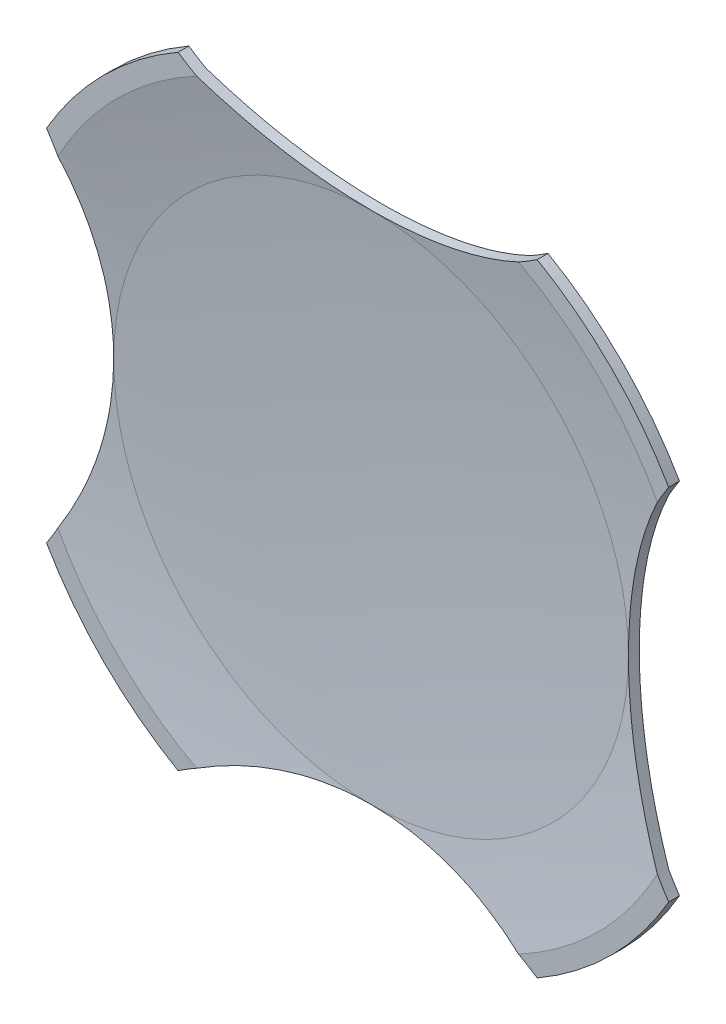
ISO-10303-21;
HEADER;
FILE_DESCRIPTION(('STEP AP214'),'2;1');
FILE_NAME('part.step','',(''),(''),'','','');
FILE_SCHEMA(('AUTOMOTIVE_DESIGN { 1 0 10303 214 1 1 1 1 }'));
ENDSEC;
DATA;
#1=APPLICATION_CONTEXT('core data for automotive mechanical design processes');
#2=APPLICATION_PROTOCOL_DEFINITION('international standard','automotive_design',2000,#1);
#3=PRODUCT_CONTEXT('',#1,'mechanical');
#4=PRODUCT('Part','Part','',(#3));
#5=PRODUCT_RELATED_PRODUCT_CATEGORY('part','',(#4));
#6=PRODUCT_DEFINITION_FORMATION('','',#4);
#7=PRODUCT_DEFINITION_CONTEXT('part definition',#1,'design');
#8=PRODUCT_DEFINITION('design','',#6,#7);
#9=PRODUCT_DEFINITION_SHAPE('','',#8);
#10=(LENGTH_UNIT() NAMED_UNIT(*) SI_UNIT(.MILLI.,.METRE.));
#11=(NAMED_UNIT(*) PLANE_ANGLE_UNIT() SI_UNIT($,.RADIAN.));
#12=(NAMED_UNIT(*) SI_UNIT($,.STERADIAN.) SOLID_ANGLE_UNIT());
#13=UNCERTAINTY_MEASURE_WITH_UNIT(LENGTH_MEASURE(1.E-05),#10,'distance_accuracy_value','');
#14=(GEOMETRIC_REPRESENTATION_CONTEXT(3) GLOBAL_UNCERTAINTY_ASSIGNED_CONTEXT((#13)) GLOBAL_UNIT_ASSIGNED_CONTEXT((#10,
#11,#12)) REPRESENTATION_CONTEXT('',''));
#15=CARTESIAN_POINT('',(0.,0.,0.));
#16=DIRECTION('',(0.,0.,1.));
#17=DIRECTION('',(1.,0.,0.));
#18=AXIS2_PLACEMENT_3D('',#15,#16,#17);
#19=CARTESIAN_POINT('',(0.,0.,-22.1284260553821));
#20=DIRECTION('',(0.,0.,-1.));
#21=DIRECTION('',(-1.,0.,0.));
#22=AXIS2_PLACEMENT_3D('',#19,#20,#21);
#23=CYLINDRICAL_SURFACE('',#22,5.);
#24=CARTESIAN_POINT('',(0.,0.,-37.6425302170665));
#25=DIRECTION('',(0.,0.,-1.));
#26=DIRECTION('',(-1.,0.,0.));
#27=AXIS2_PLACEMENT_3D('',#24,#25,#26);
#28=CIRCLE('',#27,5.);
#29=CARTESIAN_POINT('',(-4.33012701892217,2.50000000000005,-37.6425302170665));
#30=VERTEX_POINT('',#29);
#31=CARTESIAN_POINT('',(-2.5,4.3301270189222,-37.6425302170665));
#32=VERTEX_POINT('',#31);
#33=EDGE_CURVE('E195',#30,#32,#28,.T.);
#34=ORIENTED_EDGE('',*,*,#33,.F.);
#35=DIRECTION('',(0.,0.,1.));
#36=VECTOR('',#35,1.);
#37=CARTESIAN_POINT('',(-4.33012701892217,2.50000000000005,-47.4925302170665));
#38=LINE('',#37,#36);
#39=CARTESIAN_POINT('',(-4.33012701892217,2.50000000000005,-37.4925302170665));
#40=VERTEX_POINT('',#39);
#41=EDGE_CURVE('E181',#30,#40,#38,.T.);
#42=ORIENTED_EDGE('',*,*,#41,.T.);
#43=CARTESIAN_POINT('',(0.,0.,-37.4925302170665));
#44=DIRECTION('',(0.,0.,-1.));
#45=DIRECTION('',(-1.,0.,0.));
#46=AXIS2_PLACEMENT_3D('',#43,#44,#45);
#47=CIRCLE('',#46,5.);
#48=CARTESIAN_POINT('',(-2.5,4.3301270189222,-37.4925302170665));
#49=VERTEX_POINT('',#48);
#50=EDGE_CURVE('E193',#40,#49,#47,.T.);
#51=ORIENTED_EDGE('',*,*,#50,.T.);
#52=DIRECTION('',(0.,0.,1.));
#53=VECTOR('',#52,1.);
#54=CARTESIAN_POINT('',(-2.5,4.3301270189222,-47.4925302170665));
#55=LINE('',#54,#53);
#56=EDGE_CURVE('E350',#32,#49,#55,.T.);
#57=ORIENTED_EDGE('',*,*,#56,.F.);
#58=EDGE_LOOP('',(#34,#42,#51,#57));
#59=FACE_BOUND('',#58,.T.);
#60=ADVANCED_FACE('F29',(#59),#23,.T.);
#61=CARTESIAN_POINT('',(0.,0.,-12.));
#62=DIRECTION('',(0.,0.,-1.));
#63=DIRECTION('',(1.,0.,0.));
#64=AXIS2_PLACEMENT_3D('',#61,#62,#63);
#65=SPHERICAL_SURFACE('',#64,25.9287625460482);
#66=CARTESIAN_POINT('',(0.,0.,-37.4925302170665));
#67=DIRECTION('',(0.,0.,-1.));
#68=DIRECTION('',(-1.,0.,0.));
#69=AXIS2_PLACEMENT_3D('',#66,#67,#68);
#70=CIRCLE('',#69,4.73620420815078);
#71=CARTESIAN_POINT('',(-4.17229491602755,2.24133563639983,-37.4925302170665));
#72=VERTEX_POINT('',#71);
#73=CARTESIAN_POINT('',(-2.24133563639987,4.17229491602753,-37.4925302170665));
#74=VERTEX_POINT('',#73);
#75=EDGE_CURVE('E211',#72,#74,#70,.T.);
#76=ORIENTED_EDGE('',*,*,#75,.F.);
#77=CARTESIAN_POINT('',(-4.17292154292962,2.24244354888726,-37.4923302170665));
#78=CARTESIAN_POINT('',(-4.11281800264861,2.13624149741195,-37.5115131499322));
#79=CARTESIAN_POINT('',(-4.0569005784397,2.02741857356783,-37.5293390035229));
#80=CARTESIAN_POINT('',(-3.95385444309307,1.80526629233131,-37.5621596965935));
#81=CARTESIAN_POINT('',(-3.90672653381185,1.69193652492829,-37.5771542777814));
#82=CARTESIAN_POINT('',(-3.82171221751695,1.4615937684917,-37.6041840187986));
#83=CARTESIAN_POINT('',(-3.7838203513221,1.34458300160843,-37.6162209268644));
#84=CARTESIAN_POINT('',(-3.71757647863109,1.10763037862041,-37.6372531390217));
#85=CARTESIAN_POINT('',(-3.68922393002569,0.987688689492486,-37.6462486159545));
#86=CARTESIAN_POINT('',(-3.64229179546113,0.745603190981985,-37.6611337487199));
#87=CARTESIAN_POINT('',(-3.62372115012692,0.623457472198658,-37.6670205632583));
#88=CARTESIAN_POINT('',(-3.59655792433484,0.377907031933697,-37.6756298153394));
#89=CARTESIAN_POINT('',(-3.58796883384632,0.254501885307606,-37.6783511460967));
#90=CARTESIAN_POINT('',(-3.58086063428347,0.00738909651793048,-37.6806033394471));
#91=CARTESIAN_POINT('',(-3.58234019643315,-0.116318503576414,-37.6801346230357));
#92=CARTESIAN_POINT('',(-3.59535255927493,-0.363150457748729,-37.6760115028452));
#93=CARTESIAN_POINT('',(-3.60688534934782,-0.486274812442641,-37.6723571024311));
#94=CARTESIAN_POINT('',(-3.63972261305064,-0.729753465923197,-37.6619477884293));
#95=CARTESIAN_POINT('',(-3.66092271460979,-0.850123284702711,-37.655225991105));
#96=CARTESIAN_POINT('',(-3.71286145675114,-1.08853145486506,-37.6387486402067));
#97=CARTESIAN_POINT('',(-3.74359674661429,-1.20657060978208,-37.6289941523347));
#98=CARTESIAN_POINT('',(-3.8142914172297,-1.43940281136317,-37.6065409756374));
#99=CARTESIAN_POINT('',(-3.85423967188119,-1.55419958750166,-37.5938458380275));
#100=CARTESIAN_POINT('',(-3.94302283158369,-1.77988591594547,-37.5656056836411));
#101=CARTESIAN_POINT('',(-3.99185284775528,-1.89077757789877,-37.5500622346551));
#102=CARTESIAN_POINT('',(-4.06505431718618,-2.040580245222,-37.5267358345232));
#103=CARTESIAN_POINT('',(-4.08580995980305,-2.08147459707031,-37.5201194224263));
#104=CARTESIAN_POINT('',(-4.12848983066145,-2.16251332557255,-37.5065084708246));
#105=CARTESIAN_POINT('',(-4.15041245298359,-2.20265863519941,-37.4995144507789));
#106=CARTESIAN_POINT('',(-4.17292154292958,-2.24244354888733,-37.4923302170665));
#107=B_SPLINE_CURVE_WITH_KNOTS('',3,(#77,#78,#79,#80,#81,#82,#83,#84,#85,#86,#87,#88,#89,#90,
#91,#92,#93,#94,#95,#96,#97,#98,#99,#100,#101,#102,#103,#104,#105,#106),.UNSPECIFIED.,.F.,.F.,
(4,2,2,2,2,2,2,2,2,2,2,2,2,2,4),(0.,0.370489371738804,0.74101252624633,1.11131614031478,
1.48159870686857,1.85221912568412,2.22296908996027,2.59367012672748,2.96437077192462,
3.33116062966296,3.69782174108992,4.06404234917663,4.43006198138046,4.5690494671513,
4.70785039796375),.UNSPECIFIED.);
#108=CARTESIAN_POINT('',(-3.58253168950533,0.,-37.6800738679437));
#109=VERTEX_POINT('',#108);
#110=EDGE_CURVE('E184',#72,#109,#107,.T.);
#111=ORIENTED_EDGE('',*,*,#110,.T.);
#112=CARTESIAN_POINT('',(0.,0.,-37.6800738679437));
#113=DIRECTION('',(0.,0.,-1.));
#114=DIRECTION('',(-1.,0.,0.));
#115=AXIS2_PLACEMENT_3D('',#112,#113,#114);
#116=CIRCLE('',#115,3.58253168950533);
#117=CARTESIAN_POINT('',(0.,3.58253168950534,-37.6800738679437));
#118=VERTEX_POINT('',#117);
#119=EDGE_CURVE('E380',#109,#118,#116,.T.);
#120=ORIENTED_EDGE('',*,*,#119,.T.);
#121=CARTESIAN_POINT('',(2.24244354888728,4.1729215429296,-37.4923302170665));
#122=CARTESIAN_POINT('',(2.13624149741197,4.1128180026486,-37.5115131499322));
#123=CARTESIAN_POINT('',(2.02741857356785,4.05690057843968,-37.5293390035229));
#124=CARTESIAN_POINT('',(1.80526629233133,3.95385444309305,-37.5621596965935));
#125=CARTESIAN_POINT('',(1.6919365249283,3.90672653381184,-37.5771542777814));
#126=CARTESIAN_POINT('',(1.46159376849171,3.82171221751694,-37.6041840187986));
#127=CARTESIAN_POINT('',(1.34458300160844,3.78382035132209,-37.6162209268644));
#128=CARTESIAN_POINT('',(1.10763037862041,3.71757647863108,-37.6372531390217));
#129=CARTESIAN_POINT('',(0.987688689492486,3.68922393002569,-37.6462486159545));
#130=CARTESIAN_POINT('',(0.745603190981982,3.64229179546113,-37.6611337487199));
#131=CARTESIAN_POINT('',(0.623457472198653,3.62372115012692,-37.6670205632583));
#132=CARTESIAN_POINT('',(0.377907031933689,3.59655792433484,-37.6756298153394));
#133=CARTESIAN_POINT('',(0.254501885307597,3.58796883384633,-37.6783511460967));
#134=CARTESIAN_POINT('',(0.00738909651791883,3.58086063428348,-37.6806033394471));
#135=CARTESIAN_POINT('',(-0.116318503576427,3.58234019643317,-37.6801346230357));
#136=CARTESIAN_POINT('',(-0.363150457748744,3.59535255927494,-37.6760115028452));
#137=CARTESIAN_POINT('',(-0.486274812442658,3.60688534934784,-37.6723571024311));
#138=CARTESIAN_POINT('',(-0.729753465923215,3.63972261305066,-37.6619477884293));
#139=CARTESIAN_POINT('',(-0.85012328470273,3.66092271460981,-37.655225991105));
#140=CARTESIAN_POINT('',(-1.08853145486508,3.71286145675117,-37.6387486402067));
#141=CARTESIAN_POINT('',(-1.2065706097821,3.74359674661432,-37.6289941523347));
#142=CARTESIAN_POINT('',(-1.4394028113632,3.81429141722974,-37.6065409756374));
#143=CARTESIAN_POINT('',(-1.55419958750168,3.85423967188123,-37.5938458380275));
#144=CARTESIAN_POINT('',(-1.77988591594549,3.94302283158374,-37.5656056836411));
#145=CARTESIAN_POINT('',(-1.89077757789879,3.99185284775533,-37.5500622346551));
#146=CARTESIAN_POINT('',(-2.04058024522201,4.06505431718622,-37.5267358345232));
#147=CARTESIAN_POINT('',(-2.08147459707031,4.08580995980309,-37.5201194224263));
#148=CARTESIAN_POINT('',(-2.16251332557253,4.12848983066148,-37.5065084708246));
#149=CARTESIAN_POINT('',(-2.20265863519938,4.15041245298361,-37.4995144507789));
#150=CARTESIAN_POINT('',(-2.24244354888728,4.17292154292959,-37.4923302170665));
#151=B_SPLINE_CURVE_WITH_KNOTS('',3,(#121,#122,#123,#124,#125,#126,#127,#128,#129,#130,#131,
#132,#133,#134,#135,#136,#137,#138,#139,#140,#141,#142,#143,#144,#145,#146,#147,#148,#149,#150),
.UNSPECIFIED.,.F.,.F.,(4,2,2,2,2,2,2,2,2,2,2,2,2,2,4),(0.,0.370489371738808,0.741012526246338,
1.11131614031479,1.48159870686858,1.85221912568414,2.2229690899603,2.59367012672751,
2.96437077192465,3.331160629663,3.69782174108996,4.06404234917667,4.43006198138051,
4.5690494671513,4.70785039796373),.UNSPECIFIED.);
#152=EDGE_CURVE('E308',#118,#74,#151,.T.);
#153=ORIENTED_EDGE('',*,*,#152,.T.);
#154=EDGE_LOOP('',(#76,#111,#120,#153));
#155=FACE_BOUND('',#154,.T.);
#156=ADVANCED_FACE('F302',(#155),#65,.F.);
#157=CARTESIAN_POINT('',(4.73620420815078,0.,-37.4925302170665));
#158=DIRECTION('',(0.,0.,-1.));
#159=DIRECTION('',(-1.,0.,0.));
#160=AXIS2_PLACEMENT_3D('',#157,#158,#159);
#161=PLANE('',#160);
#162=ORIENTED_EDGE('',*,*,#50,.F.);
#163=CARTESIAN_POINT('',(-8.13639827256497,0.,-37.4925302170665));
#164=DIRECTION('',(0.,0.,1.));
#165=DIRECTION('',(1.,0.,0.));
#166=AXIS2_PLACEMENT_3D('',#163,#164,#165);
#167=CIRCLE('',#166,4.55386658305965);
#168=EDGE_CURVE('E178',#72,#40,#167,.T.);
#169=ORIENTED_EDGE('',*,*,#168,.F.);
#170=ORIENTED_EDGE('',*,*,#75,.T.);
#171=CARTESIAN_POINT('',(0.,8.13639827256503,-37.4925302170665));
#172=DIRECTION('',(0.,0.,1.));
#173=DIRECTION('',(1.,0.,0.));
#174=AXIS2_PLACEMENT_3D('',#171,#172,#173);
#175=CIRCLE('',#174,4.5538665830597);
#176=EDGE_CURVE('E201',#49,#74,#175,.T.);
#177=ORIENTED_EDGE('',*,*,#176,.F.);
#178=EDGE_LOOP('',(#162,#169,#170,#177));
#179=FACE_BOUND('',#178,.T.);
#180=ADVANCED_FACE('F199',(#179),#161,.F.);
#181=CARTESIAN_POINT('',(0.,0.,-12.));
#182=DIRECTION('',(0.,0.,-1.));
#183=DIRECTION('',(1.,0.,0.));
#184=AXIS2_PLACEMENT_3D('',#181,#182,#183);
#185=SPHERICAL_SURFACE('',#184,26.0787625460482);
#186=CARTESIAN_POINT('',(0.,0.,-37.6425302170665));
#187=DIRECTION('',(0.,0.,-1.));
#188=DIRECTION('',(-1.,0.,0.));
#189=AXIS2_PLACEMENT_3D('',#186,#187,#188);
#190=CIRCLE('',#189,4.75);
#191=CARTESIAN_POINT('',(-2.25550022849385,-4.18033715377889,-37.6425302170665));
#192=VERTEX_POINT('',#191);
#193=CARTESIAN_POINT('',(-4.18033715377884,-2.25550022849394,-37.6425302170665));
#194=VERTEX_POINT('',#193);
#195=EDGE_CURVE('E472',#192,#194,#190,.T.);
#196=ORIENTED_EDGE('',*,*,#195,.T.);
#197=CARTESIAN_POINT('',(-4.18096746781603,-2.25660541636122,-37.6423302170665));
#198=CARTESIAN_POINT('',(-4.11977528567286,-2.14937789208978,-37.6617463569727));
#199=CARTESIAN_POINT('',(-4.06285913541969,-2.03945167112216,-37.6797843149509));
#200=CARTESIAN_POINT('',(-3.95798876936843,-1.81491559552115,-37.7129902320779));
#201=CARTESIAN_POINT('',(-3.91003936761874,-1.70030326502719,-37.7281566496146));
#202=CARTESIAN_POINT('',(-3.8244410381779,-1.46954951801231,-37.7552122744544));
#203=CARTESIAN_POINT('',(-3.78660574535028,-1.35348418976983,-37.7671608113852));
#204=CARTESIAN_POINT('',(-3.7203424458863,-1.11850004764182,-37.7880760374229));
#205=CARTESIAN_POINT('',(-3.69190919973963,-0.999582862784922,-37.7970443873224));
#206=CARTESIAN_POINT('',(-3.64807808765498,-0.776939655047439,-37.8108647839507));
#207=CARTESIAN_POINT('',(-3.63139319598592,-0.673490097352437,-37.8161234596428));
#208=CARTESIAN_POINT('',(-3.60506898335614,-0.464695208799387,-37.8244185035906));
#209=CARTESIAN_POINT('',(-3.59549215811951,-0.359341215650038,-37.8274351598088));
#210=CARTESIAN_POINT('',(-3.58960699568496,-0.253751730625078,-37.829289336118));
#211=B_SPLINE_CURVE_WITH_KNOTS('',3,(#197,#198,#199,#200,#201,#202,#203,#204,#205,#206,#207,
#208,#209,#210),.UNSPECIFIED.,.F.,.F.,(4,2,2,2,2,2,4),(0.,0.374834507725614,0.749869681636266,
1.11742493109367,1.48477500523878,1.79926281940706,2.11648395010854),.UNSPECIFIED.);
#212=CARTESIAN_POINT('',(-3.59024190042956,-0.26488317500351,-37.829089336118));
#213=VERTEX_POINT('',#212);
#214=EDGE_CURVE('E46',#194,#213,#211,.T.);
#215=ORIENTED_EDGE('',*,*,#214,.T.);
#216=CARTESIAN_POINT('',(0.,0.,-37.829089336118));
#217=DIRECTION('',(0.,0.,-1.));
#218=DIRECTION('',(-1.,0.,0.));
#219=AXIS2_PLACEMENT_3D('',#216,#217,#218);
#220=CIRCLE('',#219,3.6);
#221=CARTESIAN_POINT('',(-0.264883175003352,-3.59024190042957,-37.829089336118));
#222=VERTEX_POINT('',#221);
#223=EDGE_CURVE('E478',#222,#213,#220,.T.);
#224=ORIENTED_EDGE('',*,*,#223,.F.);
#225=CARTESIAN_POINT('',(-0.253751730624965,-3.58960699568498,-37.829289336118));
#226=CARTESIAN_POINT('',(-0.378524587123689,-3.59655306855766,-37.8271006567921));
#227=CARTESIAN_POINT('',(-0.502976546903352,-3.6086670709195,-37.8232849905371));
#228=CARTESIAN_POINT('',(-0.750364763267615,-3.64304644813919,-37.812450797684));
#229=CARTESIAN_POINT('',(-0.87330059838666,-3.66531458318975,-37.8054314002168));
#230=CARTESIAN_POINT('',(-1.11431436611534,-3.71927653411756,-37.7884115482382));
#231=CARTESIAN_POINT('',(-1.23244028942039,-3.75077586902131,-37.7784725930906));
#232=CARTESIAN_POINT('',(-1.46546907214121,-3.82305013306563,-37.7556507478403));
#233=CARTESIAN_POINT('',(-1.58037343676904,-3.86382064647313,-37.7427692592121));
#234=CARTESIAN_POINT('',(-1.78998767933097,-3.94778357712239,-37.7162167340098));
#235=CARTESIAN_POINT('',(-1.88522561006613,-3.98978479557575,-37.7029255585383));
#236=CARTESIAN_POINT('',(-2.07317040271631,-4.08045693479305,-37.6742067495267));
#237=CARTESIAN_POINT('',(-2.16584840605774,-4.12918217644241,-37.6587617036948));
#238=CARTESIAN_POINT('',(-2.25660541636112,-4.18096746781609,-37.6423302170665));
#239=B_SPLINE_CURVE_WITH_KNOTS('',3,(#225,#226,#227,#228,#229,#230,#231,#232,#233,#234,#235,
#236,#237,#238),.UNSPECIFIED.,.F.,.F.,(4,2,2,2,2,2,4),(0.,0.374833680779689,0.749769313203306,
1.1173131453082,1.48468228670898,1.79922742257281,2.11648123570463),.UNSPECIFIED.);
#240=EDGE_CURVE('E254',#222,#192,#239,.T.);
#241=ORIENTED_EDGE('',*,*,#240,.T.);
#242=EDGE_LOOP('',(#196,#215,#224,#241));
#243=FACE_BOUND('',#242,.T.);
#244=ADVANCED_FACE('F461',(#243),#185,.T.);
#245=CARTESIAN_POINT('',(4.75,0.,-37.6425302170665));
#246=DIRECTION('',(0.,0.,1.));
#247=DIRECTION('',(1.,0.,0.));
#248=AXIS2_PLACEMENT_3D('',#245,#246,#247);
#249=PLANE('',#248);
#250=CARTESIAN_POINT('',(-4.18033715377887,2.25550022849388,-37.6425302170665));
#251=VERTEX_POINT('',#250);
#252=CARTESIAN_POINT('',(-2.25550022849391,4.18033715377886,-37.6425302170665));
#253=VERTEX_POINT('',#252);
#254=EDGE_CURVE('E467',#251,#253,#190,.T.);
#255=ORIENTED_EDGE('',*,*,#254,.F.);
#256=CARTESIAN_POINT('',(-8.13639827256497,0.,-37.6425302170665));
#257=DIRECTION('',(0.,0.,1.));
#258=DIRECTION('',(1.,0.,0.));
#259=AXIS2_PLACEMENT_3D('',#256,#257,#258);
#260=CIRCLE('',#259,4.55386658305965);
#261=EDGE_CURVE('E468',#251,#30,#260,.T.);
#262=ORIENTED_EDGE('',*,*,#261,.T.);
#263=ORIENTED_EDGE('',*,*,#33,.T.);
#264=CARTESIAN_POINT('',(0.,8.13639827256503,-37.6425302170665));
#265=DIRECTION('',(0.,0.,1.));
#266=DIRECTION('',(1.,0.,0.));
#267=AXIS2_PLACEMENT_3D('',#264,#265,#266);
#268=CIRCLE('',#267,4.5538665830597);
#269=EDGE_CURVE('E392',#32,#253,#268,.T.);
#270=ORIENTED_EDGE('',*,*,#269,.T.);
#271=EDGE_LOOP('',(#255,#262,#263,#270));
#272=FACE_BOUND('',#271,.T.);
#273=ADVANCED_FACE('F430',(#272),#249,.F.);
#274=CARTESIAN_POINT('',(-2.50000000000003,-4.33012701892218,-37.4925302170665));
#275=VERTEX_POINT('',#274);
#276=CARTESIAN_POINT('',(-4.33012701892222,-2.49999999999995,-37.4925302170665));
#277=VERTEX_POINT('',#276);
#278=EDGE_CURVE('E202',#275,#277,#47,.T.);
#279=ORIENTED_EDGE('',*,*,#278,.T.);
#280=DIRECTION('',(0.,0.,1.));
#281=VECTOR('',#280,1.);
#282=CARTESIAN_POINT('',(-4.33012701892222,-2.49999999999995,-47.4925302170665));
#283=LINE('',#282,#281);
#284=CARTESIAN_POINT('',(-4.33012701892222,-2.49999999999995,-37.6425302170665));
#285=VERTEX_POINT('',#284);
#286=EDGE_CURVE('E196',#285,#277,#283,.T.);
#287=ORIENTED_EDGE('',*,*,#286,.F.);
#288=CARTESIAN_POINT('',(-2.50000000000003,-4.33012701892218,-37.6425302170665));
#289=VERTEX_POINT('',#288);
#290=EDGE_CURVE('E218',#289,#285,#28,.T.);
#291=ORIENTED_EDGE('',*,*,#290,.F.);
#292=DIRECTION('',(0.,0.,1.));
#293=VECTOR('',#292,1.);
#294=CARTESIAN_POINT('',(-2.50000000000003,-4.33012701892218,-47.4925302170665));
#295=LINE('',#294,#293);
#296=EDGE_CURVE('E236',#289,#275,#295,.T.);
#297=ORIENTED_EDGE('',*,*,#296,.T.);
#298=EDGE_LOOP('',(#279,#287,#291,#297));
#299=FACE_BOUND('',#298,.T.);
#300=ADVANCED_FACE('F425',(#299),#23,.T.);
#301=CARTESIAN_POINT('',(0.,-3.58253168950534,-37.6800738679437));
#302=VERTEX_POINT('',#301);
#303=EDGE_CURVE('E369',#302,#109,#116,.T.);
#304=ORIENTED_EDGE('',*,*,#303,.T.);
#305=CARTESIAN_POINT('',(-4.17229491602752,-2.24133563639989,-37.4925302170665));
#306=VERTEX_POINT('',#305);
#307=EDGE_CURVE('E243',#109,#306,#107,.T.);
#308=ORIENTED_EDGE('',*,*,#307,.T.);
#309=CARTESIAN_POINT('',(-2.2413356363998,-4.17229491602757,-37.4925302170665));
#310=VERTEX_POINT('',#309);
#311=EDGE_CURVE('E371',#310,#306,#70,.T.);
#312=ORIENTED_EDGE('',*,*,#311,.F.);
#313=CARTESIAN_POINT('',(-2.24244354888722,-4.17292154292963,-37.4923302170665));
#314=CARTESIAN_POINT('',(-2.13624149741191,-4.11281800264863,-37.5115131499322));
#315=CARTESIAN_POINT('',(-2.02741857356779,-4.05690057843971,-37.5293390035229));
#316=CARTESIAN_POINT('',(-1.80526629233127,-3.95385444309308,-37.5621596965935));
#317=CARTESIAN_POINT('',(-1.69193652492825,-3.90672653381187,-37.5771542777814));
#318=CARTESIAN_POINT('',(-1.46159376849166,-3.82171221751696,-37.6041840187986));
#319=CARTESIAN_POINT('',(-1.34458300160838,-3.78382035132211,-37.6162209268644));
#320=CARTESIAN_POINT('',(-1.10763037862035,-3.7175764786311,-37.6372531390217));
#321=CARTESIAN_POINT('',(-0.987688689492433,-3.6892239300257,-37.6462486159545));
#322=CARTESIAN_POINT('',(-0.74560319098193,-3.64229179546114,-37.6611337487199));
#323=CARTESIAN_POINT('',(-0.623457472198601,-3.62372115012693,-37.6670205632583));
#324=CARTESIAN_POINT('',(-0.377907031933638,-3.59655792433485,-37.6756298153394));
#325=CARTESIAN_POINT('',(-0.254501885307547,-3.58796883384633,-37.6783511460967));
#326=CARTESIAN_POINT('',(-0.00738909651786773,-3.58086063428348,-37.6806033394471));
#327=CARTESIAN_POINT('',(0.116318503576478,-3.58234019643316,-37.6801346230357));
#328=CARTESIAN_POINT('',(0.363150457748796,-3.59535255927494,-37.6760115028452));
#329=CARTESIAN_POINT('',(0.486274812442709,-3.60688534934783,-37.6723571024311));
#330=CARTESIAN_POINT('',(0.729753465923267,-3.63972261305065,-37.6619477884293));
#331=CARTESIAN_POINT('',(0.850123284702783,-3.6609227146098,-37.655225991105));
#332=CARTESIAN_POINT('',(1.08853145486513,-3.71286145675116,-37.6387486402067));
#333=CARTESIAN_POINT('',(1.20657060978216,-3.7435967466143,-37.6289941523347));
#334=CARTESIAN_POINT('',(1.43940281136325,-3.81429141722972,-37.6065409756374));
#335=CARTESIAN_POINT('',(1.55419958750174,-3.85423967188121,-37.5938458380275));
#336=CARTESIAN_POINT('',(1.77988591594555,-3.94302283158371,-37.5656056836411));
#337=CARTESIAN_POINT('',(1.89077757789885,-3.9918528477553,-37.5500622346551));
#338=CARTESIAN_POINT('',(2.04058024522207,-4.06505431718619,-37.5267358345232));
#339=CARTESIAN_POINT('',(2.08147459707038,-4.08580995980306,-37.5201194224263));
#340=CARTESIAN_POINT('',(2.1625133255726,-4.12848983066145,-37.5065084708246));
#341=CARTESIAN_POINT('',(2.20265863519945,-4.15041245298358,-37.4995144507789));
#342=CARTESIAN_POINT('',(2.24244354888735,-4.17292154292956,-37.4923302170665));
#343=B_SPLINE_CURVE_WITH_KNOTS('',3,(#313,#314,#315,#316,#317,#318,#319,#320,#321,#322,#323,
#324,#325,#326,#327,#328,#329,#330,#331,#332,#333,#334,#335,#336,#337,#338,#339,#340,#341,#342),
.UNSPECIFIED.,.F.,.F.,(4,2,2,2,2,2,2,2,2,2,2,2,2,2,4),(0.,0.370489371738808,0.741012526246338,
1.11131614031479,1.48159870686858,1.85221912568414,2.2229690899603,2.59367012672751,
2.96437077192465,3.331160629663,3.69782174108996,4.06404234917667,4.43006198138051,
4.56904946715131,4.70785039796373),.UNSPECIFIED.);
#344=EDGE_CURVE('E292',#310,#302,#343,.T.);
#345=ORIENTED_EDGE('',*,*,#344,.T.);
#346=EDGE_LOOP('',(#304,#308,#312,#345));
#347=FACE_BOUND('',#346,.T.);
#348=ADVANCED_FACE('F367',(#347),#65,.F.);
#349=CARTESIAN_POINT('',(4.18033715377887,-2.25550022849387,-37.6425302170665));
#350=VERTEX_POINT('',#349);
#351=CARTESIAN_POINT('',(2.25550022849397,-4.18033715377882,-37.6425302170665));
#352=VERTEX_POINT('',#351);
#353=EDGE_CURVE('E475',#350,#352,#190,.T.);
#354=ORIENTED_EDGE('',*,*,#353,.T.);
#355=CARTESIAN_POINT('',(2.25660541636125,-4.18096746781602,-37.6423302170665));
#356=CARTESIAN_POINT('',(2.14937789208981,-4.11977528567285,-37.6617463569727));
#357=CARTESIAN_POINT('',(2.03945167112219,-4.06285913541968,-37.6797843149509));
#358=CARTESIAN_POINT('',(1.81491559552118,-3.95798876936842,-37.7129902320779));
#359=CARTESIAN_POINT('',(1.70030326502722,-3.91003936761873,-37.7281566496146));
#360=CARTESIAN_POINT('',(1.46954951801234,-3.8244410381779,-37.7552122744544));
#361=CARTESIAN_POINT('',(1.35348418976986,-3.78660574535027,-37.7671608113852));
#362=CARTESIAN_POINT('',(1.11850004764184,-3.7203424458863,-37.7880760374229));
#363=CARTESIAN_POINT('',(0.999582862784939,-3.69190919973962,-37.7970443873224));
#364=CARTESIAN_POINT('',(0.776939655047446,-3.64807808765498,-37.8108647839507));
#365=CARTESIAN_POINT('',(0.673490097352436,-3.63139319598592,-37.8161234596428));
#366=CARTESIAN_POINT('',(0.464695208799367,-3.60506898335614,-37.8244185035906));
#367=CARTESIAN_POINT('',(0.35934121565001,-3.59549215811952,-37.8274351598088));
#368=CARTESIAN_POINT('',(0.253751730625041,-3.58960699568497,-37.829289336118));
#369=B_SPLINE_CURVE_WITH_KNOTS('',3,(#355,#356,#357,#358,#359,#360,#361,#362,#363,#364,#365,
#366,#367,#368),.UNSPECIFIED.,.F.,.F.,(4,2,2,2,2,2,4),(0.,0.374834507725618,0.749869681636274,
1.11742493109368,1.4847750052388,1.7992628194071,2.11648395010861),.UNSPECIFIED.);
#370=CARTESIAN_POINT('',(0.26488317500346,-3.59024190042956,-37.829089336118));
#371=VERTEX_POINT('',#370);
#372=EDGE_CURVE('E282',#352,#371,#369,.T.);
#373=ORIENTED_EDGE('',*,*,#372,.T.);
#374=CARTESIAN_POINT('',(3.59024190042957,-0.264883175003315,-37.829089336118));
#375=VERTEX_POINT('',#374);
#376=EDGE_CURVE('E38',#375,#371,#220,.T.);
#377=ORIENTED_EDGE('',*,*,#376,.F.);
#378=CARTESIAN_POINT('',(3.58960699568498,-0.253751730624905,-37.829289336118));
#379=CARTESIAN_POINT('',(3.59655306855766,-0.37852458712363,-37.8271006567921));
#380=CARTESIAN_POINT('',(3.6086670709195,-0.502976546903296,-37.8232849905371));
#381=CARTESIAN_POINT('',(3.64304644813918,-0.750364763267562,-37.812450797684));
#382=CARTESIAN_POINT('',(3.66531458318973,-0.873300598386608,-37.8054314002168));
#383=CARTESIAN_POINT('',(3.71927653411754,-1.11431436611529,-37.7884115482382));
#384=CARTESIAN_POINT('',(3.75077586902129,-1.23244028942034,-37.7784725930906));
#385=CARTESIAN_POINT('',(3.82305013306561,-1.46546907214117,-37.7556507478403));
#386=CARTESIAN_POINT('',(3.8638206464731,-1.58037343676901,-37.7427692592121));
#387=CARTESIAN_POINT('',(3.94778357712236,-1.78998767933095,-37.7162167340098));
#388=CARTESIAN_POINT('',(3.98978479557572,-1.88522561006611,-37.7029255585383));
#389=CARTESIAN_POINT('',(4.08045693479303,-2.07317040271632,-37.6742067495267));
#390=CARTESIAN_POINT('',(4.12918217644239,-2.16584840605776,-37.6587617036948));
#391=CARTESIAN_POINT('',(4.18096746781607,-2.25660541636115,-37.6423302170665));
#392=B_SPLINE_CURVE_WITH_KNOTS('',3,(#378,#379,#380,#381,#382,#383,#384,#385,#386,#387,#388,
#389,#390,#391),.UNSPECIFIED.,.F.,.F.,(4,2,2,2,2,2,4),(0.,0.374833680779693,0.749769313203314,
1.11731314530821,1.48468228670899,1.79922742257286,2.11648123570471),.UNSPECIFIED.);
#393=EDGE_CURVE('E328',#375,#350,#392,.T.);
#394=ORIENTED_EDGE('',*,*,#393,.T.);
#395=EDGE_LOOP('',(#354,#373,#377,#394));
#396=FACE_BOUND('',#395,.T.);
#397=ADVANCED_FACE('F452',(#396),#185,.T.);
#398=CARTESIAN_POINT('',(4.33012701892219,-2.50000000000002,-37.6425302170665));
#399=VERTEX_POINT('',#398);
#400=CARTESIAN_POINT('',(2.49999999999997,-4.33012701892221,-37.6425302170665));
#401=VERTEX_POINT('',#400);
#402=EDGE_CURVE('E476',#399,#401,#28,.T.);
#403=ORIENTED_EDGE('',*,*,#402,.T.);
#404=CARTESIAN_POINT('',(1.21751971420689E-13,-8.13639827256503,-37.6425302170665));
#405=DIRECTION('',(0.,0.,1.));
#406=DIRECTION('',(1.,0.,0.));
#407=AXIS2_PLACEMENT_3D('',#404,#405,#406);
#408=CIRCLE('',#407,4.5538665830597);
#409=EDGE_CURVE('E255',#401,#352,#408,.T.);
#410=ORIENTED_EDGE('',*,*,#409,.T.);
#411=ORIENTED_EDGE('',*,*,#353,.F.);
#412=CARTESIAN_POINT('',(8.1363982725651,0.,-37.6425302170665));
#413=DIRECTION('',(0.,0.,1.));
#414=DIRECTION('',(1.,0.,0.));
#415=AXIS2_PLACEMENT_3D('',#412,#413,#414);
#416=CIRCLE('',#415,4.55386658305975);
#417=EDGE_CURVE('E325',#350,#399,#416,.T.);
#418=ORIENTED_EDGE('',*,*,#417,.T.);
#419=EDGE_LOOP('',(#403,#410,#411,#418));
#420=FACE_BOUND('',#419,.T.);
#421=ADVANCED_FACE('F447',(#420),#249,.F.);
#422=ORIENTED_EDGE('',*,*,#311,.T.);
#423=EDGE_CURVE('E188',#277,#306,#167,.T.);
#424=ORIENTED_EDGE('',*,*,#423,.F.);
#425=ORIENTED_EDGE('',*,*,#278,.F.);
#426=CARTESIAN_POINT('',(1.21751971420689E-13,-8.13639827256503,-37.4925302170665));
#427=DIRECTION('',(0.,0.,1.));
#428=DIRECTION('',(1.,0.,0.));
#429=AXIS2_PLACEMENT_3D('',#426,#427,#428);
#430=CIRCLE('',#429,4.5538665830597);
#431=EDGE_CURVE('E237',#310,#275,#430,.T.);
#432=ORIENTED_EDGE('',*,*,#431,.F.);
#433=EDGE_LOOP('',(#422,#424,#425,#432));
#434=FACE_BOUND('',#433,.T.);
#435=ADVANCED_FACE('F445',(#434),#161,.F.);
#436=CARTESIAN_POINT('',(2.25550022849391,4.18033715377886,-37.6425302170665));
#437=VERTEX_POINT('',#436);
#438=CARTESIAN_POINT('',(4.18033715377884,2.25550022849394,-37.6425302170665));
#439=VERTEX_POINT('',#438);
#440=EDGE_CURVE('E473',#437,#439,#190,.T.);
#441=ORIENTED_EDGE('',*,*,#440,.T.);
#442=CARTESIAN_POINT('',(4.18096746781604,2.25660541636122,-37.6423302170665));
#443=CARTESIAN_POINT('',(4.11977528567287,2.14937789208978,-37.6617463569727));
#444=CARTESIAN_POINT('',(4.0628591354197,2.03945167112216,-37.6797843149509));
#445=CARTESIAN_POINT('',(3.95798876936843,1.81491559552114,-37.7129902320779));
#446=CARTESIAN_POINT('',(3.91003936761875,1.70030326502718,-37.7281566496146));
#447=CARTESIAN_POINT('',(3.82444103817791,1.4695495180123,-37.7552122744544));
#448=CARTESIAN_POINT('',(3.78660574535029,1.35348418976981,-37.7671608113852));
#449=CARTESIAN_POINT('',(3.72034244588631,1.1185000476418,-37.7880760374229));
#450=CARTESIAN_POINT('',(3.69190919973964,0.999582862784894,-37.7970443873224));
#451=CARTESIAN_POINT('',(3.64807808765499,0.77693965504739,-37.8108647839507));
#452=CARTESIAN_POINT('',(3.63139319598593,0.67349009735237,-37.8161234596428));
#453=CARTESIAN_POINT('',(3.60506898335615,0.46469520879928,-37.8244185035906));
#454=CARTESIAN_POINT('',(3.59549215811952,0.359341215649912,-37.8274351598088));
#455=CARTESIAN_POINT('',(3.58960699568497,0.253751730624932,-37.829289336118));
#456=B_SPLINE_CURVE_WITH_KNOTS('',3,(#442,#443,#444,#445,#446,#447,#448,#449,#450,#451,#452,
#453,#454,#455),.UNSPECIFIED.,.F.,.F.,(4,2,2,2,2,2,4),(0.,0.374834507725623,0.749869681636284,
1.1174249310937,1.48477500523881,1.79926281940715,2.11648395010868),.UNSPECIFIED.);
#457=CARTESIAN_POINT('',(3.59024190042957,0.264883175003368,-37.829089336118));
#458=VERTEX_POINT('',#457);
#459=EDGE_CURVE('E341',#439,#458,#456,.T.);
#460=ORIENTED_EDGE('',*,*,#459,.T.);
#461=CARTESIAN_POINT('',(0.264883175003406,3.59024190042957,-37.829089336118));
#462=VERTEX_POINT('',#461);
#463=EDGE_CURVE('E11',#462,#458,#220,.T.);
#464=ORIENTED_EDGE('',*,*,#463,.F.);
#465=CARTESIAN_POINT('',(0.25375173062496,3.58960699568497,-37.829289336118));
#466=CARTESIAN_POINT('',(0.378524587123684,3.59655306855765,-37.8271006567921));
#467=CARTESIAN_POINT('',(0.502976546903348,3.60866707091949,-37.8232849905371));
#468=CARTESIAN_POINT('',(0.750364763267613,3.64304644813917,-37.812450797684));
#469=CARTESIAN_POINT('',(0.873300598386658,3.66531458318972,-37.8054314002168));
#470=CARTESIAN_POINT('',(1.11431436611534,3.71927653411753,-37.7884115482382));
#471=CARTESIAN_POINT('',(1.23244028942039,3.75077586902128,-37.7784725930906));
#472=CARTESIAN_POINT('',(1.46546907214121,3.82305013306559,-37.7556507478403));
#473=CARTESIAN_POINT('',(1.58037343676905,3.86382064647309,-37.7427692592121));
#474=CARTESIAN_POINT('',(1.78998767933099,3.94778357712235,-37.7162167340098));
#475=CARTESIAN_POINT('',(1.88522561006615,3.9897847955757,-37.7029255585383));
#476=CARTESIAN_POINT('',(2.07317040271635,4.08045693479302,-37.6742067495267));
#477=CARTESIAN_POINT('',(2.1658484060578,4.12918217644238,-37.6587617036948));
#478=CARTESIAN_POINT('',(2.25660541636119,4.18096746781605,-37.6423302170665));
#479=B_SPLINE_CURVE_WITH_KNOTS('',3,(#465,#466,#467,#468,#469,#470,#471,#472,#473,#474,#475,
#476,#477,#478),.UNSPECIFIED.,.F.,.F.,(4,2,2,2,2,2,4),(0.,0.374833680779689,0.749769313203307,
1.1173131453082,1.48468228670898,1.79922742257284,2.11648123570469),.UNSPECIFIED.);
#480=EDGE_CURVE('E404',#462,#437,#479,.T.);
#481=ORIENTED_EDGE('',*,*,#480,.T.);
#482=EDGE_LOOP('',(#441,#460,#464,#481));
#483=FACE_BOUND('',#482,.T.);
#484=ADVANCED_FACE('F446',(#483),#185,.T.);
#485=CARTESIAN_POINT('',(2.5,4.3301270189222,-37.6425302170665));
#486=VERTEX_POINT('',#485);
#487=CARTESIAN_POINT('',(4.33012701892221,2.49999999999998,-37.6425302170665));
#488=VERTEX_POINT('',#487);
#489=EDGE_CURVE('E219',#486,#488,#28,.T.);
#490=ORIENTED_EDGE('',*,*,#489,.T.);
#491=EDGE_CURVE('E329',#488,#439,#416,.T.);
#492=ORIENTED_EDGE('',*,*,#491,.T.);
#493=ORIENTED_EDGE('',*,*,#440,.F.);
#494=EDGE_CURVE('E409',#437,#486,#268,.T.);
#495=ORIENTED_EDGE('',*,*,#494,.T.);
#496=EDGE_LOOP('',(#490,#492,#493,#495));
#497=FACE_BOUND('',#496,.T.);
#498=ADVANCED_FACE('F439',(#497),#249,.F.);
#499=CARTESIAN_POINT('',(4.33012701892219,-2.50000000000002,-37.4925302170665));
#500=VERTEX_POINT('',#499);
#501=CARTESIAN_POINT('',(2.49999999999996,-4.33012701892221,-37.4925302170665));
#502=VERTEX_POINT('',#501);
#503=EDGE_CURVE('E207',#500,#502,#47,.T.);
#504=ORIENTED_EDGE('',*,*,#503,.T.);
#505=DIRECTION('',(0.,0.,1.));
#506=VECTOR('',#505,1.);
#507=CARTESIAN_POINT('',(2.49999999999997,-4.33012701892221,-47.4925302170665));
#508=LINE('',#507,#506);
#509=EDGE_CURVE('E54',#401,#502,#508,.T.);
#510=ORIENTED_EDGE('',*,*,#509,.F.);
#511=ORIENTED_EDGE('',*,*,#402,.F.);
#512=DIRECTION('',(0.,0.,1.));
#513=VECTOR('',#512,1.);
#514=CARTESIAN_POINT('',(4.33012701892219,-2.50000000000002,-47.4925302170665));
#515=LINE('',#514,#513);
#516=EDGE_CURVE('E227',#399,#500,#515,.T.);
#517=ORIENTED_EDGE('',*,*,#516,.T.);
#518=EDGE_LOOP('',(#504,#510,#511,#517));
#519=FACE_BOUND('',#518,.T.);
#520=ADVANCED_FACE('F224',(#519),#23,.T.);
#521=CARTESIAN_POINT('',(2.24133563639988,4.17229491602755,-37.4925302170665));
#522=VERTEX_POINT('',#521);
#523=CARTESIAN_POINT('',(4.17229491602752,2.2413356363999,-37.4925302170665));
#524=VERTEX_POINT('',#523);
#525=EDGE_CURVE('E203',#522,#524,#70,.T.);
#526=ORIENTED_EDGE('',*,*,#525,.T.);
#527=CARTESIAN_POINT('',(8.1363982725651,0.,-37.4925302170665));
#528=DIRECTION('',(0.,0.,1.));
#529=DIRECTION('',(1.,0.,0.));
#530=AXIS2_PLACEMENT_3D('',#527,#528,#529);
#531=CIRCLE('',#530,4.55386658305975);
#532=CARTESIAN_POINT('',(4.33012701892221,2.49999999999998,-37.4925302170665));
#533=VERTEX_POINT('',#532);
#534=EDGE_CURVE('E293',#533,#524,#531,.T.);
#535=ORIENTED_EDGE('',*,*,#534,.F.);
#536=CARTESIAN_POINT('',(2.5,4.3301270189222,-37.4925302170665));
#537=VERTEX_POINT('',#536);
#538=EDGE_CURVE('E205',#537,#533,#47,.T.);
#539=ORIENTED_EDGE('',*,*,#538,.F.);
#540=EDGE_CURVE('E349',#522,#537,#175,.T.);
#541=ORIENTED_EDGE('',*,*,#540,.F.);
#542=EDGE_LOOP('',(#526,#535,#539,#541));
#543=FACE_BOUND('',#542,.T.);
#544=ADVANCED_FACE('F359',(#543),#161,.F.);
#545=CARTESIAN_POINT('',(3.58253168950535,0.,-37.6800738679437));
#546=VERTEX_POINT('',#545);
#547=EDGE_CURVE('E378',#546,#302,#116,.T.);
#548=ORIENTED_EDGE('',*,*,#547,.T.);
#549=CARTESIAN_POINT('',(2.24133563639992,-4.1722949160275,-37.4925302170665));
#550=VERTEX_POINT('',#549);
#551=EDGE_CURVE('E287',#302,#550,#343,.T.);
#552=ORIENTED_EDGE('',*,*,#551,.T.);
#553=CARTESIAN_POINT('',(4.17229491602757,-2.24133563639984,-37.4925302170665));
#554=VERTEX_POINT('',#553);
#555=EDGE_CURVE('E209',#554,#550,#70,.T.);
#556=ORIENTED_EDGE('',*,*,#555,.F.);
#557=CARTESIAN_POINT('',(4.17292154292961,-2.24244354888725,-37.4923302170665));
#558=CARTESIAN_POINT('',(4.11281800264861,-2.13624149741193,-37.5115131499322));
#559=CARTESIAN_POINT('',(4.0569005784397,-2.02741857356781,-37.5293390035229));
#560=CARTESIAN_POINT('',(3.95385444309307,-1.80526629233129,-37.5621596965935));
#561=CARTESIAN_POINT('',(3.90672653381186,-1.69193652492826,-37.5771542777814));
#562=CARTESIAN_POINT('',(3.82171221751695,-1.46159376849167,-37.6041840187986));
#563=CARTESIAN_POINT('',(3.7838203513221,-1.34458300160839,-37.6162209268644));
#564=CARTESIAN_POINT('',(3.71757647863109,-1.10763037862036,-37.6372531390217));
#565=CARTESIAN_POINT('',(3.6892239300257,-0.987688689492439,-37.6462486159545));
#566=CARTESIAN_POINT('',(3.64229179546114,-0.745603190981934,-37.6611337487199));
#567=CARTESIAN_POINT('',(3.62372115012693,-0.623457472198604,-37.6670205632583));
#568=CARTESIAN_POINT('',(3.59655792433485,-0.377907031933637,-37.6756298153394));
#569=CARTESIAN_POINT('',(3.58796883384634,-0.254501885307544,-37.6783511460967));
#570=CARTESIAN_POINT('',(3.58086063428349,-0.00738909651786332,-37.6806033394471));
#571=CARTESIAN_POINT('',(3.58234019643318,0.116318503576484,-37.6801346230357));
#572=CARTESIAN_POINT('',(3.59535255927495,0.363150457748803,-37.6760115028452));
#573=CARTESIAN_POINT('',(3.60688534934785,0.486274812442718,-37.6723571024311));
#574=CARTESIAN_POINT('',(3.63972261305067,0.729753465923278,-37.6619477884293));
#575=CARTESIAN_POINT('',(3.66092271460982,0.850123284702794,-37.655225991105));
#576=CARTESIAN_POINT('',(3.71286145675118,1.08853145486515,-37.6387486402067));
#577=CARTESIAN_POINT('',(3.74359674661433,1.20657060978217,-37.6289941523347));
#578=CARTESIAN_POINT('',(3.81429141722975,1.43940281136327,-37.6065409756374));
#579=CARTESIAN_POINT('',(3.85423967188124,1.55419958750175,-37.5938458380275));
#580=CARTESIAN_POINT('',(3.94302283158375,1.77988591594557,-37.5656056836411));
#581=CARTESIAN_POINT('',(3.99185284775534,1.89077757789886,-37.5500622346551));
#582=CARTESIAN_POINT('',(4.06505431718623,2.04058024522208,-37.5267358345231));
#583=CARTESIAN_POINT('',(4.08580995980309,2.08147459707038,-37.5201194224263));
#584=CARTESIAN_POINT('',(4.12848983066147,2.16251332557258,-37.5065084708246));
#585=CARTESIAN_POINT('',(4.1504124529836,2.20265863519942,-37.4995144507789));
#586=CARTESIAN_POINT('',(4.17292154292958,2.24244354888732,-37.4923302170665));
#587=B_SPLINE_CURVE_WITH_KNOTS('',3,(#557,#558,#559,#560,#561,#562,#563,#564,#565,#566,#567,
#568,#569,#570,#571,#572,#573,#574,#575,#576,#577,#578,#579,#580,#581,#582,#583,#584,#585,#586),
.UNSPECIFIED.,.F.,.F.,(4,2,2,2,2,2,2,2,2,2,2,2,2,2,4),(0.,0.370489371738812,0.741012526246346,
1.1113161403148,1.4815987068686,1.85221912568416,2.22296908996032,2.59367012672754,
2.96437077192468,3.33116062966303,3.69782174108999,4.06404234917672,4.43006198138055,
4.56904946715132,4.70785039796372),.UNSPECIFIED.);
#588=EDGE_CURVE('E323',#554,#546,#587,.T.);
#589=ORIENTED_EDGE('',*,*,#588,.T.);
#590=EDGE_LOOP('',(#548,#552,#556,#589));
#591=FACE_BOUND('',#590,.T.);
#592=ADVANCED_FACE('F303',(#591),#65,.F.);
#593=CARTESIAN_POINT('',(0.,0.,0.));
#594=DIRECTION('',(0.,0.,-1.));
#595=DIRECTION('',(1.,0.,0.));
#596=AXIS2_PLACEMENT_3D('',#593,#594,#595);
#597=SPHERICAL_SURFACE('',#596,38.);
#598=ORIENTED_EDGE('',*,*,#223,.T.);
#599=CARTESIAN_POINT('',(-3.59117177106933,-0.28038706533841,-37.828889336118));
#600=CARTESIAN_POINT('',(-3.58541171669333,-0.186924710225641,-37.8301282026617));
#601=CARTESIAN_POINT('',(-3.58253168950533,-0.093462355112872,-37.8307476359335));
#602=CARTESIAN_POINT('',(-3.58253168950533,0.0934623551126656,-37.8307476359335));
#603=CARTESIAN_POINT('',(-3.58541171669333,0.186924710225434,-37.8301282026617));
#604=CARTESIAN_POINT('',(-3.59117177106933,0.280387065338203,-37.828889336118));
#605=B_SPLINE_CURVE_WITH_KNOTS('',3,(#599,#600,#601,#602,#603,#604),.UNSPECIFIED.,.F.,.F.,(4,2,
4),(0.,0.280526310168342,0.561052620336683),.UNSPECIFIED.);
#606=CARTESIAN_POINT('',(-3.59024190042956,0.264883175003455,-37.829089336118));
#607=VERTEX_POINT('',#606);
#608=EDGE_CURVE('E490',#213,#607,#605,.T.);
#609=ORIENTED_EDGE('',*,*,#608,.T.);
#610=CARTESIAN_POINT('',(-0.264883175003406,3.59024190042957,-37.829089336118));
#611=VERTEX_POINT('',#610);
#612=EDGE_CURVE('E39',#607,#611,#220,.T.);
#613=ORIENTED_EDGE('',*,*,#612,.T.);
#614=CARTESIAN_POINT('',(-0.28038706533823,3.59117177106934,-37.828889336118));
#615=CARTESIAN_POINT('',(-0.186924710225477,3.58541171669334,-37.8301282026617));
#616=CARTESIAN_POINT('',(-0.0934623551127231,3.58253168950534,-37.8307476359335));
#617=CARTESIAN_POINT('',(0.093462355112784,3.58253168950534,-37.8307476359335));
#618=CARTESIAN_POINT('',(0.186924710225538,3.58541171669334,-37.8301282026617));
#619=CARTESIAN_POINT('',(0.280387065338291,3.59117177106934,-37.828889336118));
#620=B_SPLINE_CURVE_WITH_KNOTS('',3,(#614,#615,#616,#617,#618,#619),.UNSPECIFIED.,.F.,.F.,(4,2,
4),(0.,0.280526310168296,0.561052620336592),.UNSPECIFIED.);
#621=EDGE_CURVE('E393',#611,#462,#620,.T.);
#622=ORIENTED_EDGE('',*,*,#621,.T.);
#623=ORIENTED_EDGE('',*,*,#463,.T.);
#624=CARTESIAN_POINT('',(3.59117177106934,0.280387065338137,-37.828889336118));
#625=CARTESIAN_POINT('',(3.58541171669334,0.186924710225443,-37.8301282026617));
#626=CARTESIAN_POINT('',(3.58253168950535,0.0934623551127495,-37.8307476359335));
#627=CARTESIAN_POINT('',(3.58253168950535,-0.0934623551126381,-37.8307476359335));
#628=CARTESIAN_POINT('',(3.58541171669334,-0.186924710225332,-37.8301282026617));
#629=CARTESIAN_POINT('',(3.59117177106934,-0.280387065338026,-37.828889336118));
#630=B_SPLINE_CURVE_WITH_KNOTS('',3,(#624,#625,#626,#627,#628,#629),.UNSPECIFIED.,.F.,.F.,(4,2,
4),(0.,0.280526310168116,0.561052620336233),.UNSPECIFIED.);
#631=EDGE_CURVE('E335',#458,#375,#630,.T.);
#632=ORIENTED_EDGE('',*,*,#631,.T.);
#633=ORIENTED_EDGE('',*,*,#376,.T.);
#634=CARTESIAN_POINT('',(0.28038706533821,-3.59117177106933,-37.828889336118));
#635=CARTESIAN_POINT('',(0.186924710225465,-3.58541171669333,-37.8301282026617));
#636=CARTESIAN_POINT('',(0.0934623551127195,-3.58253168950533,-37.8307476359335));
#637=CARTESIAN_POINT('',(-0.0934623551127708,-3.58253168950534,-37.8307476359335));
#638=CARTESIAN_POINT('',(-0.186924710225516,-3.58541171669334,-37.8301282026617));
#639=CARTESIAN_POINT('',(-0.280387065338261,-3.59117177106934,-37.828889336118));
#640=B_SPLINE_CURVE_WITH_KNOTS('',3,(#634,#635,#636,#637,#638,#639),.UNSPECIFIED.,.F.,.F.,(4,2,
4),(0.,0.280526310168271,0.561052620336541),.UNSPECIFIED.);
#641=EDGE_CURVE('E262',#371,#222,#640,.T.);
#642=ORIENTED_EDGE('',*,*,#641,.T.);
#643=EDGE_LOOP('',(#598,#609,#613,#622,#623,#632,#633,#642));
#644=FACE_BOUND('',#643,.T.);
#645=ADVANCED_FACE('F31',(#644),#597,.T.);
#646=ORIENTED_EDGE('',*,*,#612,.F.);
#647=CARTESIAN_POINT('',(-3.58960699568496,0.253751730624995,-37.829289336118));
#648=CARTESIAN_POINT('',(-3.59655306855765,0.378524587123717,-37.8271006567921));
#649=CARTESIAN_POINT('',(-3.60866707091949,0.50297654690338,-37.8232849905371));
#650=CARTESIAN_POINT('',(-3.64304644813918,0.750364763267641,-37.812450797684));
#651=CARTESIAN_POINT('',(-3.66531458318973,0.873300598386684,-37.8054314002168));
#652=CARTESIAN_POINT('',(-3.71927653411754,1.11431436611536,-37.7884115482382));
#653=CARTESIAN_POINT('',(-3.7507758690213,1.23244028942041,-37.7784725930906));
#654=CARTESIAN_POINT('',(-3.82305013306561,1.46546907214123,-37.7556507478403));
#655=CARTESIAN_POINT('',(-3.86382064647311,1.58037343676906,-37.7427692592121));
#656=CARTESIAN_POINT('',(-3.94778357712237,1.78998767933099,-37.7162167340098));
#657=CARTESIAN_POINT('',(-3.98978479557572,1.88522561006615,-37.7029255585383));
#658=CARTESIAN_POINT('',(-4.08045693479303,2.07317040271633,-37.6742067495267));
#659=CARTESIAN_POINT('',(-4.12918217644239,2.16584840605777,-37.6587617036948));
#660=CARTESIAN_POINT('',(-4.18096746781607,2.25660541636115,-37.6423302170665));
#661=B_SPLINE_CURVE_WITH_KNOTS('',3,(#647,#648,#649,#650,#651,#652,#653,#654,#655,#656,#657,
#658,#659,#660),.UNSPECIFIED.,.F.,.F.,(4,2,2,2,2,2,4),(0.,0.374833680779685,0.749769313203298,
1.11731314530819,1.48468228670896,1.7992274225728,2.11648123570462),.UNSPECIFIED.);
#662=EDGE_CURVE('E493',#607,#251,#661,.T.);
#663=ORIENTED_EDGE('',*,*,#662,.T.);
#664=ORIENTED_EDGE('',*,*,#254,.T.);
#665=CARTESIAN_POINT('',(-2.25660541636118,4.18096746781605,-37.6423302170665));
#666=CARTESIAN_POINT('',(-2.14937789208975,4.11977528567288,-37.6617463569727));
#667=CARTESIAN_POINT('',(-2.03945167112212,4.06285913541971,-37.6797843149509));
#668=CARTESIAN_POINT('',(-1.81491559552112,3.95798876936844,-37.7129902320779));
#669=CARTESIAN_POINT('',(-1.70030326502715,3.91003936761875,-37.7281566496146));
#670=CARTESIAN_POINT('',(-1.46954951801228,3.82444103817792,-37.7552122744544));
#671=CARTESIAN_POINT('',(-1.3534841897698,3.78660574535029,-37.7671608113852));
#672=CARTESIAN_POINT('',(-1.11850004764178,3.72034244588631,-37.7880760374229));
#673=CARTESIAN_POINT('',(-0.999582862784879,3.69190919973964,-37.7970443873224));
#674=CARTESIAN_POINT('',(-0.776939655047388,3.64807808765499,-37.8108647839507));
#675=CARTESIAN_POINT('',(-0.673490097352379,3.63139319598593,-37.8161234596428));
#676=CARTESIAN_POINT('',(-0.464695208799313,3.60506898335615,-37.8244185035906));
#677=CARTESIAN_POINT('',(-0.359341215649956,3.59549215811952,-37.8274351598088));
#678=CARTESIAN_POINT('',(-0.253751730624989,3.58960699568497,-37.829289336118));
#679=B_SPLINE_CURVE_WITH_KNOTS('',3,(#665,#666,#667,#668,#669,#670,#671,#672,#673,#674,#675,
#676,#677,#678),.UNSPECIFIED.,.F.,.F.,(4,2,2,2,2,2,4),(0.,0.374834507725617,0.749869681636274,
1.11742493109368,1.48477500523879,1.7992628194071,2.1164839501086),.UNSPECIFIED.);
#680=EDGE_CURVE('E386',#253,#611,#679,.T.);
#681=ORIENTED_EDGE('',*,*,#680,.T.);
#682=EDGE_LOOP('',(#646,#663,#664,#681));
#683=FACE_BOUND('',#682,.T.);
#684=ADVANCED_FACE('F267',(#683),#185,.T.);
#685=ORIENTED_EDGE('',*,*,#290,.T.);
#686=EDGE_CURVE('E491',#285,#194,#260,.T.);
#687=ORIENTED_EDGE('',*,*,#686,.T.);
#688=ORIENTED_EDGE('',*,*,#195,.F.);
#689=EDGE_CURVE('E250',#192,#289,#408,.T.);
#690=ORIENTED_EDGE('',*,*,#689,.T.);
#691=EDGE_LOOP('',(#685,#687,#688,#690));
#692=FACE_BOUND('',#691,.T.);
#693=ADVANCED_FACE('F433',(#692),#249,.F.);
#694=ORIENTED_EDGE('',*,*,#538,.T.);
#695=DIRECTION('',(0.,0.,1.));
#696=VECTOR('',#695,1.);
#697=CARTESIAN_POINT('',(4.33012701892221,2.49999999999998,-47.4925302170665));
#698=LINE('',#697,#696);
#699=EDGE_CURVE('E324',#488,#533,#698,.T.);
#700=ORIENTED_EDGE('',*,*,#699,.F.);
#701=ORIENTED_EDGE('',*,*,#489,.F.);
#702=DIRECTION('',(0.,0.,1.));
#703=VECTOR('',#702,1.);
#704=CARTESIAN_POINT('',(2.5,4.3301270189222,-47.4925302170665));
#705=LINE('',#704,#703);
#706=EDGE_CURVE('E348',#486,#537,#705,.T.);
#707=ORIENTED_EDGE('',*,*,#706,.T.);
#708=EDGE_LOOP('',(#694,#700,#701,#707));
#709=FACE_BOUND('',#708,.T.);
#710=ADVANCED_FACE('F352',(#709),#23,.T.);
#711=ORIENTED_EDGE('',*,*,#555,.T.);
#712=EDGE_CURVE('E234',#502,#550,#430,.T.);
#713=ORIENTED_EDGE('',*,*,#712,.F.);
#714=ORIENTED_EDGE('',*,*,#503,.F.);
#715=EDGE_CURVE('E232',#554,#500,#531,.T.);
#716=ORIENTED_EDGE('',*,*,#715,.F.);
#717=EDGE_LOOP('',(#711,#713,#714,#716));
#718=FACE_BOUND('',#717,.T.);
#719=ADVANCED_FACE('F231',(#718),#161,.F.);
#720=EDGE_CURVE('E384',#118,#546,#116,.T.);
#721=ORIENTED_EDGE('',*,*,#720,.T.);
#722=EDGE_CURVE('E316',#546,#524,#587,.T.);
#723=ORIENTED_EDGE('',*,*,#722,.T.);
#724=ORIENTED_EDGE('',*,*,#525,.F.);
#725=EDGE_CURVE('E410',#522,#118,#151,.T.);
#726=ORIENTED_EDGE('',*,*,#725,.T.);
#727=EDGE_LOOP('',(#721,#723,#724,#726));
#728=FACE_BOUND('',#727,.T.);
#729=ADVANCED_FACE('F295',(#728),#65,.F.);
#730=CARTESIAN_POINT('',(0.,0.,0.));
#731=DIRECTION('',(0.,0.,-1.));
#732=DIRECTION('',(-1.,0.,0.));
#733=AXIS2_PLACEMENT_3D('',#730,#731,#732);
#734=SPHERICAL_SURFACE('',#733,37.85);
#735=ORIENTED_EDGE('',*,*,#720,.F.);
#736=ORIENTED_EDGE('',*,*,#119,.F.);
#737=ORIENTED_EDGE('',*,*,#303,.F.);
#738=ORIENTED_EDGE('',*,*,#547,.F.);
#739=EDGE_LOOP('',(#735,#736,#737,#738));
#740=FACE_BOUND('',#739,.T.);
#741=ADVANCED_FACE('F300',(#740),#734,.F.);
#742=CARTESIAN_POINT('',(0.,8.13639827256503,-47.4925302170665));
#743=DIRECTION('',(0.,0.,1.));
#744=DIRECTION('',(1.,0.,0.));
#745=AXIS2_PLACEMENT_3D('',#742,#743,#744);
#746=CYLINDRICAL_SURFACE('',#745,4.5538665830597);
#747=ORIENTED_EDGE('',*,*,#56,.T.);
#748=ORIENTED_EDGE('',*,*,#176,.T.);
#749=ORIENTED_EDGE('',*,*,#152,.F.);
#750=ORIENTED_EDGE('',*,*,#725,.F.);
#751=ORIENTED_EDGE('',*,*,#540,.T.);
#752=ORIENTED_EDGE('',*,*,#706,.F.);
#753=ORIENTED_EDGE('',*,*,#494,.F.);
#754=ORIENTED_EDGE('',*,*,#480,.F.);
#755=ORIENTED_EDGE('',*,*,#621,.F.);
#756=ORIENTED_EDGE('',*,*,#680,.F.);
#757=ORIENTED_EDGE('',*,*,#269,.F.);
#758=EDGE_LOOP('',(#747,#748,#749,#750,#751,#752,#753,#754,#755,#756,#757));
#759=FACE_BOUND('',#758,.T.);
#760=ADVANCED_FACE('F398',(#759),#746,.F.);
#761=CARTESIAN_POINT('',(8.1363982725651,0.,-47.4925302170665));
#762=DIRECTION('',(0.,0.,1.));
#763=DIRECTION('',(1.,0.,0.));
#764=AXIS2_PLACEMENT_3D('',#761,#762,#763);
#765=CYLINDRICAL_SURFACE('',#764,4.55386658305975);
#766=ORIENTED_EDGE('',*,*,#699,.T.);
#767=ORIENTED_EDGE('',*,*,#534,.T.);
#768=ORIENTED_EDGE('',*,*,#722,.F.);
#769=ORIENTED_EDGE('',*,*,#588,.F.);
#770=ORIENTED_EDGE('',*,*,#715,.T.);
#771=ORIENTED_EDGE('',*,*,#516,.F.);
#772=ORIENTED_EDGE('',*,*,#417,.F.);
#773=ORIENTED_EDGE('',*,*,#393,.F.);
#774=ORIENTED_EDGE('',*,*,#631,.F.);
#775=ORIENTED_EDGE('',*,*,#459,.F.);
#776=ORIENTED_EDGE('',*,*,#491,.F.);
#777=EDGE_LOOP('',(#766,#767,#768,#769,#770,#771,#772,#773,#774,#775,#776));
#778=FACE_BOUND('',#777,.T.);
#779=ADVANCED_FACE('F274',(#778),#765,.F.);
#780=CARTESIAN_POINT('',(1.21751971420689E-13,-8.13639827256503,-47.4925302170665));
#781=DIRECTION('',(0.,0.,1.));
#782=DIRECTION('',(1.,0.,0.));
#783=AXIS2_PLACEMENT_3D('',#780,#781,#782);
#784=CYLINDRICAL_SURFACE('',#783,4.5538665830597);
#785=ORIENTED_EDGE('',*,*,#431,.T.);
#786=ORIENTED_EDGE('',*,*,#296,.F.);
#787=ORIENTED_EDGE('',*,*,#689,.F.);
#788=ORIENTED_EDGE('',*,*,#240,.F.);
#789=ORIENTED_EDGE('',*,*,#641,.F.);
#790=ORIENTED_EDGE('',*,*,#372,.F.);
#791=ORIENTED_EDGE('',*,*,#409,.F.);
#792=ORIENTED_EDGE('',*,*,#509,.T.);
#793=ORIENTED_EDGE('',*,*,#712,.T.);
#794=ORIENTED_EDGE('',*,*,#551,.F.);
#795=ORIENTED_EDGE('',*,*,#344,.F.);
#796=EDGE_LOOP('',(#785,#786,#787,#788,#789,#790,#791,#792,#793,#794,#795));
#797=FACE_BOUND('',#796,.T.);
#798=ADVANCED_FACE('F270',(#797),#784,.F.);
#799=CARTESIAN_POINT('',(-8.13639827256497,0.,-47.4925302170665));
#800=DIRECTION('',(0.,0.,1.));
#801=DIRECTION('',(1.,0.,0.));
#802=AXIS2_PLACEMENT_3D('',#799,#800,#801);
#803=CYLINDRICAL_SURFACE('',#802,4.55386658305965);
#804=ORIENTED_EDGE('',*,*,#168,.T.);
#805=ORIENTED_EDGE('',*,*,#41,.F.);
#806=ORIENTED_EDGE('',*,*,#261,.F.);
#807=ORIENTED_EDGE('',*,*,#662,.F.);
#808=ORIENTED_EDGE('',*,*,#608,.F.);
#809=ORIENTED_EDGE('',*,*,#214,.F.);
#810=ORIENTED_EDGE('',*,*,#686,.F.);
#811=ORIENTED_EDGE('',*,*,#286,.T.);
#812=ORIENTED_EDGE('',*,*,#423,.T.);
#813=ORIENTED_EDGE('',*,*,#307,.F.);
#814=ORIENTED_EDGE('',*,*,#110,.F.);
#815=EDGE_LOOP('',(#804,#805,#806,#807,#808,#809,#810,#811,#812,#813,#814));
#816=FACE_BOUND('',#815,.T.);
#817=ADVANCED_FACE('F180',(#816),#803,.F.);
#818=CLOSED_SHELL('',(#60,#156,#180,#244,#273,#300,#348,#397,#421,#435,#484,#498,#520,#544,#592,
#645,#684,#693,#710,#719,#729,#741,#760,#779,#798,#817));
#819=MANIFOLD_SOLID_BREP('B2',#818);
#820=ADVANCED_BREP_SHAPE_REPRESENTATION('',(#18,#819),#14);
#821=SHAPE_DEFINITION_REPRESENTATION(#9,#820);
ENDSEC;
END-ISO-10303-21;
